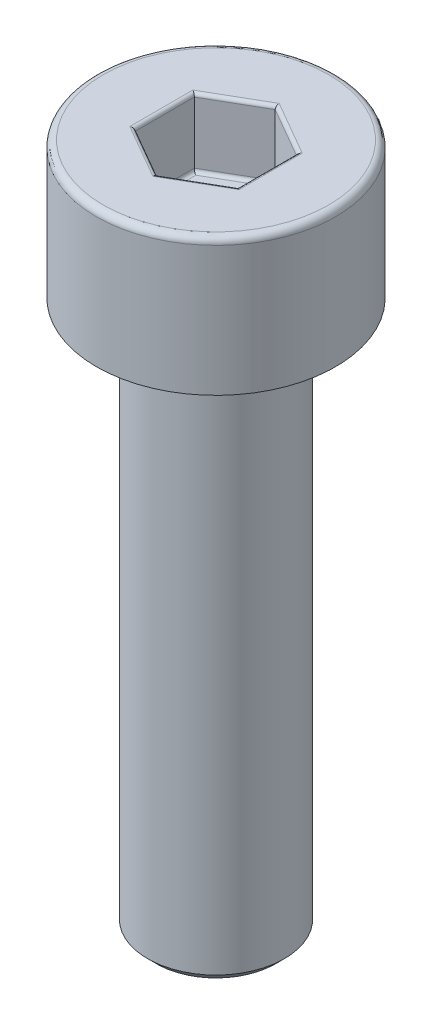
ISO-10303-21;
HEADER;
FILE_DESCRIPTION(('STEP AP214'),'2;1');
FILE_NAME('part.step','',(''),(''),'','','');
FILE_SCHEMA(('AUTOMOTIVE_DESIGN { 1 0 10303 214 1 1 1 1 }'));
ENDSEC;
DATA;
#1=APPLICATION_CONTEXT('core data for automotive mechanical design processes');
#2=APPLICATION_PROTOCOL_DEFINITION('international standard','automotive_design',2000,#1);
#3=PRODUCT_CONTEXT('',#1,'mechanical');
#4=PRODUCT('Part','Part','',(#3));
#5=PRODUCT_RELATED_PRODUCT_CATEGORY('part','',(#4));
#6=PRODUCT_DEFINITION_FORMATION('','',#4);
#7=PRODUCT_DEFINITION_CONTEXT('part definition',#1,'design');
#8=PRODUCT_DEFINITION('design','',#6,#7);
#9=PRODUCT_DEFINITION_SHAPE('','',#8);
#10=(LENGTH_UNIT() NAMED_UNIT(*) SI_UNIT(.MILLI.,.METRE.));
#11=(NAMED_UNIT(*) PLANE_ANGLE_UNIT() SI_UNIT($,.RADIAN.));
#12=(NAMED_UNIT(*) SI_UNIT($,.STERADIAN.) SOLID_ANGLE_UNIT());
#13=UNCERTAINTY_MEASURE_WITH_UNIT(LENGTH_MEASURE(1.E-05),#10,'distance_accuracy_value','');
#14=(GEOMETRIC_REPRESENTATION_CONTEXT(3) GLOBAL_UNCERTAINTY_ASSIGNED_CONTEXT((#13)) GLOBAL_UNIT_ASSIGNED_CONTEXT((#10,
#11,#12)) REPRESENTATION_CONTEXT('',''));
#15=CARTESIAN_POINT('',(0.,0.,0.));
#16=DIRECTION('',(0.,0.,1.));
#17=DIRECTION('',(1.,0.,0.));
#18=AXIS2_PLACEMENT_3D('',#15,#16,#17);
#19=CARTESIAN_POINT('',(0.,-20.,0.));
#20=DIRECTION('',(0.,-1.,0.));
#21=DIRECTION('',(0.,0.,-1.));
#22=AXIS2_PLACEMENT_3D('',#19,#20,#21);
#23=PLANE('',#22);
#24=CARTESIAN_POINT('',(0.,-20.,0.));
#25=DIRECTION('',(0.,-1.,0.));
#26=DIRECTION('',(0.,0.,-1.));
#27=AXIS2_PLACEMENT_3D('',#24,#25,#26);
#28=CIRCLE('',#27,1.74999999999999);
#29=CARTESIAN_POINT('',(0.,-20.,-1.74999999999999));
#30=VERTEX_POINT('',#29);
#31=EDGE_CURVE('E261',#30,#30,#28,.T.);
#32=ORIENTED_EDGE('',*,*,#31,.T.);
#33=EDGE_LOOP('',(#32));
#34=FACE_BOUND('',#33,.T.);
#35=ADVANCED_FACE('F33',(#34),#23,.T.);
#36=CARTESIAN_POINT('',(0.,0.,0.));
#37=DIRECTION('',(0.,1.,0.));
#38=DIRECTION('',(0.,0.,1.));
#39=AXIS2_PLACEMENT_3D('',#36,#37,#38);
#40=CYLINDRICAL_SURFACE('',#39,2.);
#41=CARTESIAN_POINT('',(0.,-4.25,0.));
#42=DIRECTION('',(0.,-1.,0.));
#43=DIRECTION('',(0.,0.,-1.));
#44=AXIS2_PLACEMENT_3D('',#41,#42,#43);
#45=CIRCLE('',#44,2.);
#46=CARTESIAN_POINT('',(0.,-4.25,-2.));
#47=VERTEX_POINT('',#46);
#48=EDGE_CURVE('E258',#47,#47,#45,.T.);
#49=ORIENTED_EDGE('',*,*,#48,.T.);
#50=EDGE_LOOP('',(#49));
#51=FACE_BOUND('',#50,.T.);
#52=CARTESIAN_POINT('',(0.,-19.75,0.));
#53=DIRECTION('',(0.,-1.,0.));
#54=DIRECTION('',(0.,0.,-1.));
#55=AXIS2_PLACEMENT_3D('',#52,#53,#54);
#56=CIRCLE('',#55,2.);
#57=CARTESIAN_POINT('',(0.,-19.75,-2.));
#58=VERTEX_POINT('',#57);
#59=EDGE_CURVE('E255',#58,#58,#56,.F.);
#60=ORIENTED_EDGE('',*,*,#59,.T.);
#61=EDGE_LOOP('',(#60));
#62=FACE_BOUND('',#61,.T.);
#63=ADVANCED_FACE('F287',(#51,#62),#40,.T.);
#64=CARTESIAN_POINT('',(-2.,-4.,0.));
#65=DIRECTION('',(0.,-1.,0.));
#66=DIRECTION('',(0.,0.,-1.));
#67=AXIS2_PLACEMENT_3D('',#64,#65,#66);
#68=PLANE('',#67);
#69=CARTESIAN_POINT('',(0.,-4.,0.));
#70=DIRECTION('',(0.,-1.,0.));
#71=DIRECTION('',(0.,0.,-1.));
#72=AXIS2_PLACEMENT_3D('',#69,#70,#71);
#73=CIRCLE('',#72,2.25);
#74=CARTESIAN_POINT('',(0.,-4.,-2.25));
#75=VERTEX_POINT('',#74);
#76=EDGE_CURVE('E252',#75,#75,#73,.F.);
#77=ORIENTED_EDGE('',*,*,#76,.T.);
#78=EDGE_LOOP('',(#77));
#79=FACE_BOUND('',#78,.T.);
#80=CARTESIAN_POINT('',(0.,-4.,0.));
#81=DIRECTION('',(0.,1.,0.));
#82=DIRECTION('',(0.,0.,1.));
#83=AXIS2_PLACEMENT_3D('',#80,#81,#82);
#84=CIRCLE('',#83,3.5);
#85=CARTESIAN_POINT('',(0.,-4.,3.5));
#86=VERTEX_POINT('',#85);
#87=EDGE_CURVE('E249',#86,#86,#84,.T.);
#88=ORIENTED_EDGE('',*,*,#87,.F.);
#89=EDGE_LOOP('',(#88));
#90=FACE_BOUND('',#89,.T.);
#91=ADVANCED_FACE('F293',(#79,#90),#68,.T.);
#92=CARTESIAN_POINT('',(0.,0.,0.));
#93=DIRECTION('',(0.,1.,0.));
#94=DIRECTION('',(0.,0.,1.));
#95=AXIS2_PLACEMENT_3D('',#92,#93,#94);
#96=CYLINDRICAL_SURFACE('',#95,3.5);
#97=CARTESIAN_POINT('',(0.,-0.2,0.));
#98=DIRECTION('',(0.,1.,0.));
#99=DIRECTION('',(0.,0.,1.));
#100=AXIS2_PLACEMENT_3D('',#97,#98,#99);
#101=CIRCLE('',#100,3.5);
#102=CARTESIAN_POINT('',(0.,-0.2,3.5));
#103=VERTEX_POINT('',#102);
#104=EDGE_CURVE('E159',#103,#103,#101,.F.);
#105=ORIENTED_EDGE('',*,*,#104,.T.);
#106=EDGE_LOOP('',(#105));
#107=FACE_BOUND('',#106,.T.);
#108=ORIENTED_EDGE('',*,*,#87,.T.);
#109=EDGE_LOOP('',(#108));
#110=FACE_BOUND('',#109,.T.);
#111=ADVANCED_FACE('F303',(#107,#110),#96,.T.);
#112=CARTESIAN_POINT('',(-3.5,0.,0.));
#113=DIRECTION('',(0.,1.,0.));
#114=DIRECTION('',(0.,0.,1.));
#115=AXIS2_PLACEMENT_3D('',#112,#113,#114);
#116=PLANE('',#115);
#117=DIRECTION('',(0.,0.,1.));
#118=VECTOR('',#117,1.);
#119=CARTESIAN_POINT('',(-1.6,0.,-0.86602540378444));
#120=LINE('',#119,#118);
#121=CARTESIAN_POINT('',(-1.6,0.,0.923760430703401));
#122=VERTEX_POINT('',#121);
#123=CARTESIAN_POINT('',(-1.6,0.,-0.923760430703403));
#124=VERTEX_POINT('',#123);
#125=EDGE_CURVE('E175',#122,#124,#120,.F.);
#126=ORIENTED_EDGE('',*,*,#125,.T.);
#127=DIRECTION('',(-0.866025403784439,0.,0.5));
#128=VECTOR('',#127,1.);
#129=CARTESIAN_POINT('',(-0.0499999999999999,0.,-1.81865334794732));
#130=LINE('',#129,#128);
#131=CARTESIAN_POINT('',(0.,0.,-1.8475208614068));
#132=VERTEX_POINT('',#131);
#133=EDGE_CURVE('E134',#124,#132,#130,.F.);
#134=ORIENTED_EDGE('',*,*,#133,.T.);
#135=DIRECTION('',(-0.866025403784439,0.,-0.5));
#136=VECTOR('',#135,1.);
#137=CARTESIAN_POINT('',(1.55,0.,-0.952627944162884));
#138=LINE('',#137,#136);
#139=CARTESIAN_POINT('',(1.6,0.,-0.923760430703403));
#140=VERTEX_POINT('',#139);
#141=EDGE_CURVE('E161',#132,#140,#138,.F.);
#142=ORIENTED_EDGE('',*,*,#141,.T.);
#143=DIRECTION('',(0.,0.,-1.));
#144=VECTOR('',#143,1.);
#145=CARTESIAN_POINT('',(1.6,0.,0.866025403784439));
#146=LINE('',#145,#144);
#147=CARTESIAN_POINT('',(1.6,0.,0.923760430703402));
#148=VERTEX_POINT('',#147);
#149=EDGE_CURVE('E169',#140,#148,#146,.F.);
#150=ORIENTED_EDGE('',*,*,#149,.T.);
#151=DIRECTION('',(0.866025403784439,0.,-0.5));
#152=VECTOR('',#151,1.);
#153=CARTESIAN_POINT('',(0.0499999999999988,0.,1.81865334794732));
#154=LINE('',#153,#152);
#155=CARTESIAN_POINT('',(0.,0.,1.8475208614068));
#156=VERTEX_POINT('',#155);
#157=EDGE_CURVE('E171',#148,#156,#154,.F.);
#158=ORIENTED_EDGE('',*,*,#157,.T.);
#159=DIRECTION('',(0.866025403784439,0.,0.5));
#160=VECTOR('',#159,1.);
#161=CARTESIAN_POINT('',(-1.55,0.,0.952627944162882));
#162=LINE('',#161,#160);
#163=EDGE_CURVE('E173',#156,#122,#162,.F.);
#164=ORIENTED_EDGE('',*,*,#163,.T.);
#165=EDGE_LOOP('',(#126,#134,#142,#150,#158,#164));
#166=FACE_BOUND('',#165,.T.);
#167=CARTESIAN_POINT('',(0.,0.,0.));
#168=DIRECTION('',(0.,1.,0.));
#169=DIRECTION('',(0.,0.,1.));
#170=AXIS2_PLACEMENT_3D('',#167,#168,#169);
#171=CIRCLE('',#170,3.3);
#172=CARTESIAN_POINT('',(0.,0.,3.3));
#173=VERTEX_POINT('',#172);
#174=EDGE_CURVE('E164',#173,#173,#171,.T.);
#175=ORIENTED_EDGE('',*,*,#174,.T.);
#176=EDGE_LOOP('',(#175));
#177=FACE_BOUND('',#176,.T.);
#178=ADVANCED_FACE('F266',(#166,#177),#116,.T.);
#179=CARTESIAN_POINT('',(0.,-4.,0.));
#180=DIRECTION('',(0.,1.,0.));
#181=DIRECTION('',(0.,0.,1.));
#182=AXIS2_PLACEMENT_3D('',#179,#180,#181);
#183=CONICAL_SURFACE('',#182,2.25,0.785398163397454);
#184=ORIENTED_EDGE('',*,*,#48,.F.);
#185=EDGE_LOOP('',(#184));
#186=FACE_BOUND('',#185,.T.);
#187=ORIENTED_EDGE('',*,*,#76,.F.);
#188=EDGE_LOOP('',(#187));
#189=FACE_BOUND('',#188,.T.);
#190=ADVANCED_FACE('F281',(#186,#189),#183,.T.);
#191=CARTESIAN_POINT('',(0.,-19.75,0.));
#192=DIRECTION('',(0.,1.,0.));
#193=DIRECTION('',(0.,0.,1.));
#194=AXIS2_PLACEMENT_3D('',#191,#192,#193);
#195=CONICAL_SURFACE('',#194,2.,0.785398163397446);
#196=ORIENTED_EDGE('',*,*,#31,.F.);
#197=EDGE_LOOP('',(#196));
#198=FACE_BOUND('',#197,.T.);
#199=ORIENTED_EDGE('',*,*,#59,.F.);
#200=EDGE_LOOP('',(#199));
#201=FACE_BOUND('',#200,.T.);
#202=ADVANCED_FACE('F271',(#198,#201),#195,.T.);
#203=CARTESIAN_POINT('',(0.,-0.2,0.));
#204=DIRECTION('',(0.,1.,0.));
#205=DIRECTION('',(0.,0.,1.));
#206=AXIS2_PLACEMENT_3D('',#203,#204,#205);
#207=TOROIDAL_SURFACE('',#206,3.3,0.2);
#208=ORIENTED_EDGE('',*,*,#104,.F.);
#209=EDGE_LOOP('',(#208));
#210=FACE_BOUND('',#209,.T.);
#211=ORIENTED_EDGE('',*,*,#174,.F.);
#212=EDGE_LOOP('',(#211));
#213=FACE_BOUND('',#212,.T.);
#214=ADVANCED_FACE('F268',(#210,#213),#207,.T.);
#215=CARTESIAN_POINT('',(1.5,-2.,-0.86602540378444));
#216=DIRECTION('',(0.5,0.,-0.866025403784439));
#217=DIRECTION('',(-0.866025403784439,0.,-0.5));
#218=AXIS2_PLACEMENT_3D('',#215,#216,#217);
#219=PLANE('',#218);
#220=DIRECTION('',(0.,1.,0.));
#221=VECTOR('',#220,1.);
#222=CARTESIAN_POINT('',(1.5,-2.,-0.86602540378444));
#223=LINE('',#222,#221);
#224=CARTESIAN_POINT('',(1.5,-1.9,-0.86602540378444));
#225=VERTEX_POINT('',#224);
#226=CARTESIAN_POINT('',(1.5,-0.1,-0.86602540378444));
#227=VERTEX_POINT('',#226);
#228=EDGE_CURVE('E243',#225,#227,#223,.T.);
#229=ORIENTED_EDGE('',*,*,#228,.T.);
#230=DIRECTION('',(-0.866025403784439,0.,-0.5));
#231=VECTOR('',#230,1.);
#232=CARTESIAN_POINT('',(0.,-0.1,-1.73205080756888));
#233=LINE('',#232,#231);
#234=CARTESIAN_POINT('',(0.,-0.1,-1.73205080756888));
#235=VERTEX_POINT('',#234);
#236=EDGE_CURVE('E195',#227,#235,#233,.T.);
#237=ORIENTED_EDGE('',*,*,#236,.T.);
#238=DIRECTION('',(0.,1.,0.));
#239=VECTOR('',#238,1.);
#240=CARTESIAN_POINT('',(0.,-2.,-1.73205080756888));
#241=LINE('',#240,#239);
#242=CARTESIAN_POINT('',(0.,-1.9,-1.73205080756888));
#243=VERTEX_POINT('',#242);
#244=EDGE_CURVE('E145',#243,#235,#241,.T.);
#245=ORIENTED_EDGE('',*,*,#244,.F.);
#246=DIRECTION('',(-0.866025403784439,0.,-0.5));
#247=VECTOR('',#246,1.);
#248=CARTESIAN_POINT('',(1.5,-1.9,-0.86602540378444));
#249=LINE('',#248,#247);
#250=EDGE_CURVE('E193',#243,#225,#249,.F.);
#251=ORIENTED_EDGE('',*,*,#250,.T.);
#252=EDGE_LOOP('',(#229,#237,#245,#251));
#253=FACE_BOUND('',#252,.T.);
#254=ADVANCED_FACE('F270',(#253),#219,.F.);
#255=CARTESIAN_POINT('',(1.5,-2.,0.866025403784439));
#256=DIRECTION('',(1.,0.,0.));
#257=DIRECTION('',(0.,0.,-1.));
#258=AXIS2_PLACEMENT_3D('',#255,#256,#257);
#259=PLANE('',#258);
#260=DIRECTION('',(0.,1.,0.));
#261=VECTOR('',#260,1.);
#262=CARTESIAN_POINT('',(1.5,-2.,0.866025403784439));
#263=LINE('',#262,#261);
#264=CARTESIAN_POINT('',(1.5,-1.9,0.866025403784439));
#265=VERTEX_POINT('',#264);
#266=CARTESIAN_POINT('',(1.5,-0.1,0.866025403784439));
#267=VERTEX_POINT('',#266);
#268=EDGE_CURVE('E240',#265,#267,#263,.T.);
#269=ORIENTED_EDGE('',*,*,#268,.T.);
#270=DIRECTION('',(0.,0.,-1.));
#271=VECTOR('',#270,1.);
#272=CARTESIAN_POINT('',(1.5,-0.1,-0.86602540378444));
#273=LINE('',#272,#271);
#274=EDGE_CURVE('E191',#267,#227,#273,.T.);
#275=ORIENTED_EDGE('',*,*,#274,.T.);
#276=ORIENTED_EDGE('',*,*,#228,.F.);
#277=DIRECTION('',(0.,0.,-1.));
#278=VECTOR('',#277,1.);
#279=CARTESIAN_POINT('',(1.5,-1.9,0.866025403784439));
#280=LINE('',#279,#278);
#281=EDGE_CURVE('E188',#225,#265,#280,.F.);
#282=ORIENTED_EDGE('',*,*,#281,.T.);
#283=EDGE_LOOP('',(#269,#275,#276,#282));
#284=FACE_BOUND('',#283,.T.);
#285=ADVANCED_FACE('F278',(#284),#259,.F.);
#286=CARTESIAN_POINT('',(0.,-2.,1.73205080756888));
#287=DIRECTION('',(0.5,0.,0.866025403784439));
#288=DIRECTION('',(0.866025403784439,0.,-0.5));
#289=AXIS2_PLACEMENT_3D('',#286,#287,#288);
#290=PLANE('',#289);
#291=DIRECTION('',(0.,1.,0.));
#292=VECTOR('',#291,1.);
#293=CARTESIAN_POINT('',(0.,-2.,1.73205080756888));
#294=LINE('',#293,#292);
#295=CARTESIAN_POINT('',(0.,-1.9,1.73205080756888));
#296=VERTEX_POINT('',#295);
#297=CARTESIAN_POINT('',(0.,-0.1,1.73205080756888));
#298=VERTEX_POINT('',#297);
#299=EDGE_CURVE('E237',#296,#298,#294,.T.);
#300=ORIENTED_EDGE('',*,*,#299,.T.);
#301=DIRECTION('',(0.866025403784439,0.,-0.5));
#302=VECTOR('',#301,1.);
#303=CARTESIAN_POINT('',(1.5,-0.1,0.866025403784439));
#304=LINE('',#303,#302);
#305=EDGE_CURVE('E186',#298,#267,#304,.T.);
#306=ORIENTED_EDGE('',*,*,#305,.T.);
#307=ORIENTED_EDGE('',*,*,#268,.F.);
#308=DIRECTION('',(0.866025403784439,0.,-0.5));
#309=VECTOR('',#308,1.);
#310=CARTESIAN_POINT('',(0.,-1.9,1.73205080756888));
#311=LINE('',#310,#309);
#312=EDGE_CURVE('E184',#265,#296,#311,.F.);
#313=ORIENTED_EDGE('',*,*,#312,.T.);
#314=EDGE_LOOP('',(#300,#306,#307,#313));
#315=FACE_BOUND('',#314,.T.);
#316=ADVANCED_FACE('F327',(#315),#290,.F.);
#317=CARTESIAN_POINT('',(-1.5,-2.,0.866025403784438));
#318=DIRECTION('',(-0.5,0.,0.866025403784439));
#319=DIRECTION('',(0.866025403784439,0.,0.5));
#320=AXIS2_PLACEMENT_3D('',#317,#318,#319);
#321=PLANE('',#320);
#322=DIRECTION('',(0.,1.,0.));
#323=VECTOR('',#322,1.);
#324=CARTESIAN_POINT('',(-1.5,-2.,0.866025403784438));
#325=LINE('',#324,#323);
#326=CARTESIAN_POINT('',(-1.5,-1.9,0.866025403784438));
#327=VERTEX_POINT('',#326);
#328=CARTESIAN_POINT('',(-1.5,-0.1,0.866025403784438));
#329=VERTEX_POINT('',#328);
#330=EDGE_CURVE('E128',#327,#329,#325,.T.);
#331=ORIENTED_EDGE('',*,*,#330,.T.);
#332=DIRECTION('',(0.866025403784439,0.,0.5));
#333=VECTOR('',#332,1.);
#334=CARTESIAN_POINT('',(0.,-0.1,1.73205080756888));
#335=LINE('',#334,#333);
#336=EDGE_CURVE('E182',#329,#298,#335,.T.);
#337=ORIENTED_EDGE('',*,*,#336,.T.);
#338=ORIENTED_EDGE('',*,*,#299,.F.);
#339=DIRECTION('',(0.866025403784439,0.,0.5));
#340=VECTOR('',#339,1.);
#341=CARTESIAN_POINT('',(-1.5,-1.9,0.866025403784438));
#342=LINE('',#341,#340);
#343=EDGE_CURVE('E180',#296,#327,#342,.F.);
#344=ORIENTED_EDGE('',*,*,#343,.T.);
#345=EDGE_LOOP('',(#331,#337,#338,#344));
#346=FACE_BOUND('',#345,.T.);
#347=ADVANCED_FACE('F234',(#346),#321,.F.);
#348=CARTESIAN_POINT('',(-1.5,-2.,-0.86602540378444));
#349=DIRECTION('',(-1.,0.,0.));
#350=DIRECTION('',(0.,0.,1.));
#351=AXIS2_PLACEMENT_3D('',#348,#349,#350);
#352=PLANE('',#351);
#353=DIRECTION('',(0.,1.,0.));
#354=VECTOR('',#353,1.);
#355=CARTESIAN_POINT('',(-1.5,-2.,-0.86602540378444));
#356=LINE('',#355,#354);
#357=CARTESIAN_POINT('',(-1.5,-1.9,-0.86602540378444));
#358=VERTEX_POINT('',#357);
#359=CARTESIAN_POINT('',(-1.5,-0.1,-0.86602540378444));
#360=VERTEX_POINT('',#359);
#361=EDGE_CURVE('E126',#358,#360,#356,.T.);
#362=ORIENTED_EDGE('',*,*,#361,.T.);
#363=DIRECTION('',(0.,0.,1.));
#364=VECTOR('',#363,1.);
#365=CARTESIAN_POINT('',(-1.5,-0.1,0.866025403784438));
#366=LINE('',#365,#364);
#367=EDGE_CURVE('E133',#360,#329,#366,.T.);
#368=ORIENTED_EDGE('',*,*,#367,.T.);
#369=ORIENTED_EDGE('',*,*,#330,.F.);
#370=DIRECTION('',(0.,0.,1.));
#371=VECTOR('',#370,1.);
#372=CARTESIAN_POINT('',(-1.5,-1.9,-0.86602540378444));
#373=LINE('',#372,#371);
#374=EDGE_CURVE('E123',#327,#358,#373,.F.);
#375=ORIENTED_EDGE('',*,*,#374,.T.);
#376=EDGE_LOOP('',(#362,#368,#369,#375));
#377=FACE_BOUND('',#376,.T.);
#378=ADVANCED_FACE('F125',(#377),#352,.F.);
#379=CARTESIAN_POINT('',(0.,-2.,-1.73205080756888));
#380=DIRECTION('',(-0.5,0.,-0.866025403784439));
#381=DIRECTION('',(-0.866025403784439,0.,0.5));
#382=AXIS2_PLACEMENT_3D('',#379,#380,#381);
#383=PLANE('',#382);
#384=ORIENTED_EDGE('',*,*,#244,.T.);
#385=DIRECTION('',(-0.866025403784439,0.,0.5));
#386=VECTOR('',#385,1.);
#387=CARTESIAN_POINT('',(-1.5,-0.1,-0.86602540378444));
#388=LINE('',#387,#386);
#389=EDGE_CURVE('E144',#235,#360,#388,.T.);
#390=ORIENTED_EDGE('',*,*,#389,.T.);
#391=ORIENTED_EDGE('',*,*,#361,.F.);
#392=DIRECTION('',(-0.866025403784439,0.,0.5));
#393=VECTOR('',#392,1.);
#394=CARTESIAN_POINT('',(0.,-1.9,-1.73205080756888));
#395=LINE('',#394,#393);
#396=EDGE_CURVE('E141',#358,#243,#395,.F.);
#397=ORIENTED_EDGE('',*,*,#396,.T.);
#398=EDGE_LOOP('',(#384,#390,#391,#397));
#399=FACE_BOUND('',#398,.T.);
#400=ADVANCED_FACE('F139',(#399),#383,.F.);
#401=CARTESIAN_POINT('',(1.5,-2.,-0.86602540378444));
#402=DIRECTION('',(0.,-1.,0.));
#403=DIRECTION('',(0.,0.,-1.));
#404=AXIS2_PLACEMENT_3D('',#401,#402,#403);
#405=PLANE('',#404);
#406=DIRECTION('',(0.866025403784439,0.,-0.5));
#407=VECTOR('',#406,1.);
#408=CARTESIAN_POINT('',(1.45,-2.,0.779422863405995));
#409=LINE('',#408,#407);
#410=CARTESIAN_POINT('',(0.,-2.,1.61658075373095));
#411=VERTEX_POINT('',#410);
#412=CARTESIAN_POINT('',(1.4,-2.,0.808290376865476));
#413=VERTEX_POINT('',#412);
#414=EDGE_CURVE('E42',#411,#413,#409,.T.);
#415=ORIENTED_EDGE('',*,*,#414,.T.);
#416=DIRECTION('',(0.,0.,-1.));
#417=VECTOR('',#416,1.);
#418=CARTESIAN_POINT('',(1.4,-2.,-0.86602540378444));
#419=LINE('',#418,#417);
#420=CARTESIAN_POINT('',(1.4,-2.,-0.808290376865478));
#421=VERTEX_POINT('',#420);
#422=EDGE_CURVE('E11',#413,#421,#419,.T.);
#423=ORIENTED_EDGE('',*,*,#422,.T.);
#424=DIRECTION('',(-0.866025403784439,0.,-0.5));
#425=VECTOR('',#424,1.);
#426=CARTESIAN_POINT('',(-0.0500000000000001,-2.,-1.64544826719043));
#427=LINE('',#426,#425);
#428=CARTESIAN_POINT('',(0.,-2.,-1.61658075373095));
#429=VERTEX_POINT('',#428);
#430=EDGE_CURVE('E197',#421,#429,#427,.T.);
#431=ORIENTED_EDGE('',*,*,#430,.T.);
#432=DIRECTION('',(-0.866025403784439,0.,0.5));
#433=VECTOR('',#432,1.);
#434=CARTESIAN_POINT('',(-1.45,-2.,-0.779422863405997));
#435=LINE('',#434,#433);
#436=CARTESIAN_POINT('',(-1.4,-2.,-0.808290376865478));
#437=VERTEX_POINT('',#436);
#438=EDGE_CURVE('E199',#429,#437,#435,.T.);
#439=ORIENTED_EDGE('',*,*,#438,.T.);
#440=DIRECTION('',(0.,0.,1.));
#441=VECTOR('',#440,1.);
#442=CARTESIAN_POINT('',(-1.4,-2.,0.866025403784438));
#443=LINE('',#442,#441);
#444=CARTESIAN_POINT('',(-1.4,-2.,0.808290376865476));
#445=VERTEX_POINT('',#444);
#446=EDGE_CURVE('E150',#437,#445,#443,.T.);
#447=ORIENTED_EDGE('',*,*,#446,.T.);
#448=DIRECTION('',(0.866025403784439,0.,0.5));
#449=VECTOR('',#448,1.);
#450=CARTESIAN_POINT('',(0.0499999999999989,-2.,1.64544826719043));
#451=LINE('',#450,#449);
#452=EDGE_CURVE('E53',#445,#411,#451,.T.);
#453=ORIENTED_EDGE('',*,*,#452,.T.);
#454=EDGE_LOOP('',(#415,#423,#431,#439,#447,#453));
#455=FACE_BOUND('',#454,.T.);
#456=ADVANCED_FACE('F322',(#455),#405,.F.);
#457=CARTESIAN_POINT('',(0.0499999999999988,-0.1,1.81865334794732));
#458=DIRECTION('',(-0.866025403784439,0.,0.5));
#459=DIRECTION('',(0.5,0.,0.866025403784439));
#460=AXIS2_PLACEMENT_3D('',#457,#458,#459);
#461=CYLINDRICAL_SURFACE('',#460,0.1);
#462=CARTESIAN_POINT('',(0.,-0.1,1.8475208614068));
#463=DIRECTION('',(-1.,0.,0.));
#464=DIRECTION('',(0.,0.,-1.));
#465=AXIS2_PLACEMENT_3D('',#462,#463,#464);
#466=ELLIPSE('',#465,0.115470053837925,0.1);
#467=EDGE_CURVE('E214',#156,#298,#466,.T.);
#468=ORIENTED_EDGE('',*,*,#467,.F.);
#469=ORIENTED_EDGE('',*,*,#157,.F.);
#470=CARTESIAN_POINT('',(1.6,-0.1,0.923760430703402));
#471=DIRECTION('',(-0.5,0.,0.866025403784439));
#472=DIRECTION('',(-0.866025403784439,0.,-0.5));
#473=AXIS2_PLACEMENT_3D('',#470,#471,#472);
#474=ELLIPSE('',#473,0.115470053837925,0.1);
#475=EDGE_CURVE('E217',#267,#148,#474,.F.);
#476=ORIENTED_EDGE('',*,*,#475,.F.);
#477=ORIENTED_EDGE('',*,*,#305,.F.);
#478=EDGE_LOOP('',(#468,#469,#476,#477));
#479=FACE_BOUND('',#478,.T.);
#480=ADVANCED_FACE('F334',(#479),#461,.T.);
#481=CARTESIAN_POINT('',(1.6,-0.1,0.866025403784439));
#482=DIRECTION('',(0.,0.,1.));
#483=DIRECTION('',(1.,0.,0.));
#484=AXIS2_PLACEMENT_3D('',#481,#482,#483);
#485=CYLINDRICAL_SURFACE('',#484,0.1);
#486=ORIENTED_EDGE('',*,*,#475,.T.);
#487=ORIENTED_EDGE('',*,*,#149,.F.);
#488=CARTESIAN_POINT('',(1.6,-0.1,-0.923760430703402));
#489=DIRECTION('',(0.5,0.,0.866025403784439));
#490=DIRECTION('',(-0.866025403784439,0.,0.5));
#491=AXIS2_PLACEMENT_3D('',#488,#489,#490);
#492=ELLIPSE('',#491,0.115470053837925,0.1);
#493=EDGE_CURVE('E211',#227,#140,#492,.F.);
#494=ORIENTED_EDGE('',*,*,#493,.F.);
#495=ORIENTED_EDGE('',*,*,#274,.F.);
#496=EDGE_LOOP('',(#486,#487,#494,#495));
#497=FACE_BOUND('',#496,.T.);
#498=ADVANCED_FACE('F338',(#497),#485,.T.);
#499=CARTESIAN_POINT('',(-1.55,-0.1,0.952627944162882));
#500=DIRECTION('',(-0.866025403784439,0.,-0.5));
#501=DIRECTION('',(-0.5,0.,0.866025403784439));
#502=AXIS2_PLACEMENT_3D('',#499,#500,#501);
#503=CYLINDRICAL_SURFACE('',#502,0.1);
#504=ORIENTED_EDGE('',*,*,#467,.T.);
#505=ORIENTED_EDGE('',*,*,#336,.F.);
#506=CARTESIAN_POINT('',(-1.6,-0.1,0.923760430703401));
#507=DIRECTION('',(-0.5,0.,-0.866025403784439));
#508=DIRECTION('',(0.866025403784439,0.,-0.5));
#509=AXIS2_PLACEMENT_3D('',#506,#507,#508);
#510=ELLIPSE('',#509,0.115470053837925,0.1);
#511=EDGE_CURVE('E208',#122,#329,#510,.T.);
#512=ORIENTED_EDGE('',*,*,#511,.F.);
#513=ORIENTED_EDGE('',*,*,#163,.F.);
#514=EDGE_LOOP('',(#504,#505,#512,#513));
#515=FACE_BOUND('',#514,.T.);
#516=ADVANCED_FACE('F344',(#515),#503,.T.);
#517=CARTESIAN_POINT('',(1.55,-0.1,-0.952627944162884));
#518=DIRECTION('',(0.866025403784439,0.,0.5));
#519=DIRECTION('',(0.5,0.,-0.866025403784439));
#520=AXIS2_PLACEMENT_3D('',#517,#518,#519);
#521=CYLINDRICAL_SURFACE('',#520,0.1);
#522=ORIENTED_EDGE('',*,*,#493,.T.);
#523=ORIENTED_EDGE('',*,*,#141,.F.);
#524=CARTESIAN_POINT('',(0.,-0.1,-1.8475208614068));
#525=DIRECTION('',(1.,0.,0.));
#526=DIRECTION('',(0.,0.,-1.));
#527=AXIS2_PLACEMENT_3D('',#524,#525,#526);
#528=ELLIPSE('',#527,0.115470053837925,0.1);
#529=EDGE_CURVE('E206',#235,#132,#528,.F.);
#530=ORIENTED_EDGE('',*,*,#529,.F.);
#531=ORIENTED_EDGE('',*,*,#236,.F.);
#532=EDGE_LOOP('',(#522,#523,#530,#531));
#533=FACE_BOUND('',#532,.T.);
#534=ADVANCED_FACE('F374',(#533),#521,.T.);
#535=CARTESIAN_POINT('',(-1.6,-0.1,-0.86602540378444));
#536=DIRECTION('',(0.,0.,-1.));
#537=DIRECTION('',(-1.,0.,0.));
#538=AXIS2_PLACEMENT_3D('',#535,#536,#537);
#539=CYLINDRICAL_SURFACE('',#538,0.1);
#540=ORIENTED_EDGE('',*,*,#511,.T.);
#541=ORIENTED_EDGE('',*,*,#367,.F.);
#542=CARTESIAN_POINT('',(-1.6,-0.1,-0.923760430703403));
#543=DIRECTION('',(0.5,0.,-0.866025403784439));
#544=DIRECTION('',(0.866025403784439,0.,0.5));
#545=AXIS2_PLACEMENT_3D('',#542,#543,#544);
#546=ELLIPSE('',#545,0.115470053837925,0.1);
#547=EDGE_CURVE('E204',#124,#360,#546,.T.);
#548=ORIENTED_EDGE('',*,*,#547,.F.);
#549=ORIENTED_EDGE('',*,*,#125,.F.);
#550=EDGE_LOOP('',(#540,#541,#548,#549));
#551=FACE_BOUND('',#550,.T.);
#552=ADVANCED_FACE('F369',(#551),#539,.T.);
#553=CARTESIAN_POINT('',(-0.05,-0.1,-1.81865334794732));
#554=DIRECTION('',(0.866025403784439,0.,-0.5));
#555=DIRECTION('',(-0.5,0.,-0.866025403784439));
#556=AXIS2_PLACEMENT_3D('',#553,#554,#555);
#557=CYLINDRICAL_SURFACE('',#556,0.1);
#558=ORIENTED_EDGE('',*,*,#529,.T.);
#559=ORIENTED_EDGE('',*,*,#133,.F.);
#560=ORIENTED_EDGE('',*,*,#547,.T.);
#561=ORIENTED_EDGE('',*,*,#389,.F.);
#562=EDGE_LOOP('',(#558,#559,#560,#561));
#563=FACE_BOUND('',#562,.T.);
#564=ADVANCED_FACE('F365',(#563),#557,.T.);
#565=CARTESIAN_POINT('',(-1.4,-1.9,-0.86602540378444));
#566=DIRECTION('',(0.,0.,-1.));
#567=DIRECTION('',(-1.,0.,0.));
#568=AXIS2_PLACEMENT_3D('',#565,#566,#567);
#569=CYLINDRICAL_SURFACE('',#568,0.1);
#570=CARTESIAN_POINT('',(-1.4,-1.9,-0.808290376865478));
#571=DIRECTION('',(0.5,0.,-0.866025403784439));
#572=DIRECTION('',(-0.866025403784439,0.,-0.5));
#573=AXIS2_PLACEMENT_3D('',#570,#571,#572);
#574=ELLIPSE('',#573,0.115470053837925,0.1);
#575=EDGE_CURVE('E149',#358,#437,#574,.F.);
#576=ORIENTED_EDGE('',*,*,#575,.F.);
#577=ORIENTED_EDGE('',*,*,#374,.F.);
#578=CARTESIAN_POINT('',(-1.4,-1.9,0.808290376865476));
#579=DIRECTION('',(-0.5,0.,-0.866025403784439));
#580=DIRECTION('',(-0.866025403784439,0.,0.5));
#581=AXIS2_PLACEMENT_3D('',#578,#579,#580);
#582=ELLIPSE('',#581,0.115470053837925,0.1);
#583=EDGE_CURVE('E37',#445,#327,#582,.T.);
#584=ORIENTED_EDGE('',*,*,#583,.F.);
#585=ORIENTED_EDGE('',*,*,#446,.F.);
#586=EDGE_LOOP('',(#576,#577,#584,#585));
#587=FACE_BOUND('',#586,.T.);
#588=ADVANCED_FACE('F35',(#587),#569,.F.);
#589=CARTESIAN_POINT('',(0.0499999999999984,-1.9,1.64544826719043));
#590=DIRECTION('',(-0.866025403784439,0.,-0.5));
#591=DIRECTION('',(-0.5,0.,0.866025403784439));
#592=AXIS2_PLACEMENT_3D('',#589,#590,#591);
#593=CYLINDRICAL_SURFACE('',#592,0.1);
#594=ORIENTED_EDGE('',*,*,#583,.T.);
#595=ORIENTED_EDGE('',*,*,#343,.F.);
#596=CARTESIAN_POINT('',(0.,-1.9,1.61658075373095));
#597=DIRECTION('',(-1.,0.,0.));
#598=DIRECTION('',(0.,0.,1.));
#599=AXIS2_PLACEMENT_3D('',#596,#597,#598);
#600=ELLIPSE('',#599,0.115470053837925,0.1);
#601=EDGE_CURVE('E153',#411,#296,#600,.T.);
#602=ORIENTED_EDGE('',*,*,#601,.F.);
#603=ORIENTED_EDGE('',*,*,#452,.F.);
#604=EDGE_LOOP('',(#594,#595,#602,#603));
#605=FACE_BOUND('',#604,.T.);
#606=ADVANCED_FACE('F231',(#605),#593,.F.);
#607=CARTESIAN_POINT('',(0.8,-1.9,-2.07846096908265));
#608=DIRECTION('',(0.866025403784439,0.,-0.5));
#609=DIRECTION('',(-0.5,0.,-0.866025403784439));
#610=AXIS2_PLACEMENT_3D('',#607,#608,#609);
#611=CYLINDRICAL_SURFACE('',#610,0.1);
#612=ORIENTED_EDGE('',*,*,#575,.T.);
#613=ORIENTED_EDGE('',*,*,#438,.F.);
#614=CARTESIAN_POINT('',(0.,-1.9,-1.61658075373095));
#615=DIRECTION('',(1.,0.,0.));
#616=DIRECTION('',(0.,0.,-1.));
#617=AXIS2_PLACEMENT_3D('',#614,#615,#616);
#618=ELLIPSE('',#617,0.115470053837925,0.1);
#619=EDGE_CURVE('E157',#243,#429,#618,.F.);
#620=ORIENTED_EDGE('',*,*,#619,.F.);
#621=ORIENTED_EDGE('',*,*,#396,.F.);
#622=EDGE_LOOP('',(#612,#613,#620,#621));
#623=FACE_BOUND('',#622,.T.);
#624=ADVANCED_FACE('F155',(#623),#611,.F.);
#625=CARTESIAN_POINT('',(2.2,-1.9,0.346410161513775));
#626=DIRECTION('',(-0.866025403784439,0.,0.5));
#627=DIRECTION('',(0.5,0.,0.866025403784439));
#628=AXIS2_PLACEMENT_3D('',#625,#626,#627);
#629=CYLINDRICAL_SURFACE('',#628,0.1);
#630=ORIENTED_EDGE('',*,*,#601,.T.);
#631=ORIENTED_EDGE('',*,*,#312,.F.);
#632=CARTESIAN_POINT('',(1.4,-1.9,0.808290376865476));
#633=DIRECTION('',(-0.5,0.,0.866025403784439));
#634=DIRECTION('',(0.866025403784439,0.,0.5));
#635=AXIS2_PLACEMENT_3D('',#632,#633,#634);
#636=ELLIPSE('',#635,0.115470053837925,0.1);
#637=EDGE_CURVE('E222',#413,#265,#636,.T.);
#638=ORIENTED_EDGE('',*,*,#637,.F.);
#639=ORIENTED_EDGE('',*,*,#414,.F.);
#640=EDGE_LOOP('',(#630,#631,#638,#639));
#641=FACE_BOUND('',#640,.T.);
#642=ADVANCED_FACE('F228',(#641),#629,.F.);
#643=CARTESIAN_POINT('',(1.45,-1.9,-0.779422863405997));
#644=DIRECTION('',(0.866025403784439,0.,0.5));
#645=DIRECTION('',(0.5,0.,-0.866025403784439));
#646=AXIS2_PLACEMENT_3D('',#643,#644,#645);
#647=CYLINDRICAL_SURFACE('',#646,0.1);
#648=ORIENTED_EDGE('',*,*,#619,.T.);
#649=ORIENTED_EDGE('',*,*,#430,.F.);
#650=CARTESIAN_POINT('',(1.4,-1.9,-0.808290376865478));
#651=DIRECTION('',(0.5,0.,0.866025403784439));
#652=DIRECTION('',(-0.866025403784439,0.,0.5));
#653=AXIS2_PLACEMENT_3D('',#650,#651,#652);
#654=ELLIPSE('',#653,0.115470053837925,0.1);
#655=EDGE_CURVE('E220',#225,#421,#654,.F.);
#656=ORIENTED_EDGE('',*,*,#655,.F.);
#657=ORIENTED_EDGE('',*,*,#250,.F.);
#658=EDGE_LOOP('',(#648,#649,#656,#657));
#659=FACE_BOUND('',#658,.T.);
#660=ADVANCED_FACE('F353',(#659),#647,.F.);
#661=CARTESIAN_POINT('',(1.4,-1.9,-0.86602540378444));
#662=DIRECTION('',(0.,0.,1.));
#663=DIRECTION('',(1.,0.,0.));
#664=AXIS2_PLACEMENT_3D('',#661,#662,#663);
#665=CYLINDRICAL_SURFACE('',#664,0.1);
#666=ORIENTED_EDGE('',*,*,#637,.T.);
#667=ORIENTED_EDGE('',*,*,#281,.F.);
#668=ORIENTED_EDGE('',*,*,#655,.T.);
#669=ORIENTED_EDGE('',*,*,#422,.F.);
#670=EDGE_LOOP('',(#666,#667,#668,#669));
#671=FACE_BOUND('',#670,.T.);
#672=ADVANCED_FACE('F350',(#671),#665,.F.);
#673=CLOSED_SHELL('',(#35,#63,#91,#111,#178,#190,#202,#214,#254,#285,#316,#347,#378,#400,#456,
#480,#498,#516,#534,#552,#564,#588,#606,#624,#642,#660,#672));
#674=MANIFOLD_SOLID_BREP('B2',#673);
#675=ADVANCED_BREP_SHAPE_REPRESENTATION('',(#18,#674),#14);
#676=SHAPE_DEFINITION_REPRESENTATION(#9,#675);
ENDSEC;
END-ISO-10303-21;
